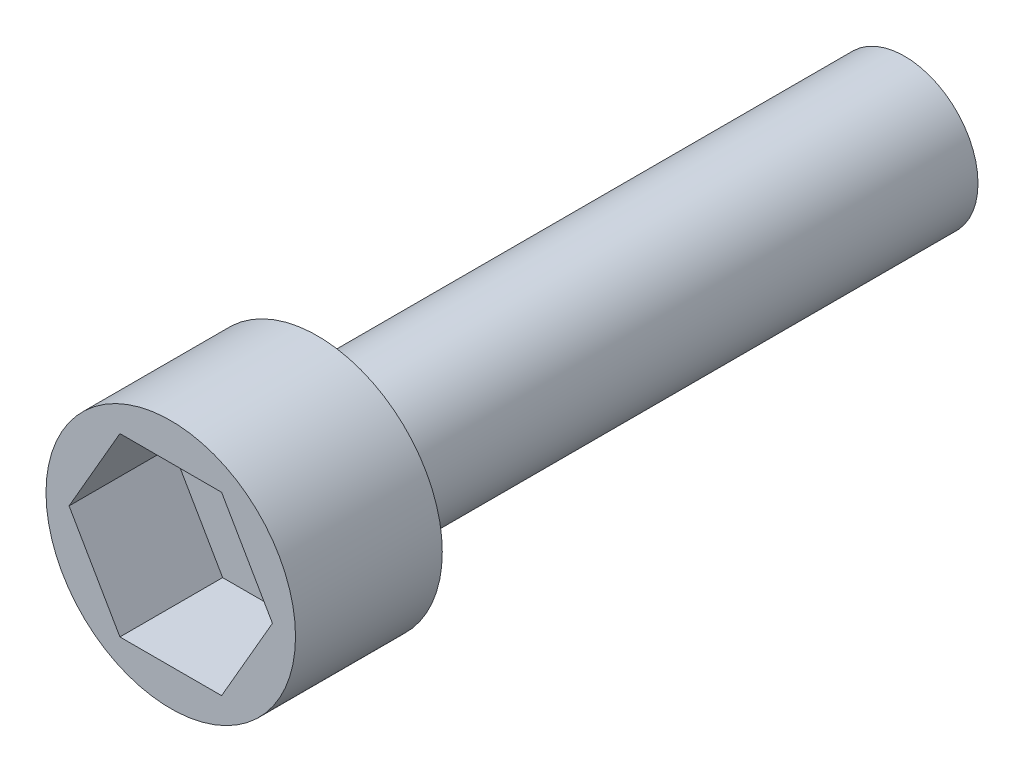
ISO-10303-21;
HEADER;
FILE_DESCRIPTION(('STEP AP214'),'2;1');
FILE_NAME('part.step','',(''),(''),'','','');
FILE_SCHEMA(('AUTOMOTIVE_DESIGN { 1 0 10303 214 1 1 1 1 }'));
ENDSEC;
DATA;
#1=APPLICATION_CONTEXT('core data for automotive mechanical design processes');
#2=APPLICATION_PROTOCOL_DEFINITION('international standard','automotive_design',2000,#1);
#3=PRODUCT_CONTEXT('',#1,'mechanical');
#4=PRODUCT('Part','Part','',(#3));
#5=PRODUCT_RELATED_PRODUCT_CATEGORY('part','',(#4));
#6=PRODUCT_DEFINITION_FORMATION('','',#4);
#7=PRODUCT_DEFINITION_CONTEXT('part definition',#1,'design');
#8=PRODUCT_DEFINITION('design','',#6,#7);
#9=PRODUCT_DEFINITION_SHAPE('','',#8);
#10=(LENGTH_UNIT() NAMED_UNIT(*) SI_UNIT(.MILLI.,.METRE.));
#11=(NAMED_UNIT(*) PLANE_ANGLE_UNIT() SI_UNIT($,.RADIAN.));
#12=(NAMED_UNIT(*) SI_UNIT($,.STERADIAN.) SOLID_ANGLE_UNIT());
#13=UNCERTAINTY_MEASURE_WITH_UNIT(LENGTH_MEASURE(1.E-05),#10,'distance_accuracy_value','');
#14=(GEOMETRIC_REPRESENTATION_CONTEXT(3) GLOBAL_UNCERTAINTY_ASSIGNED_CONTEXT((#13)) GLOBAL_UNIT_ASSIGNED_CONTEXT((#10,
#11,#12)) REPRESENTATION_CONTEXT('',''));
#15=CARTESIAN_POINT('',(0.,0.,0.));
#16=DIRECTION('',(0.,0.,1.));
#17=DIRECTION('',(1.,0.,0.));
#18=AXIS2_PLACEMENT_3D('',#15,#16,#17);
#19=CARTESIAN_POINT('',(0.,0.,20.));
#20=DIRECTION('',(0.,0.,-1.));
#21=DIRECTION('',(-1.,0.,0.));
#22=AXIS2_PLACEMENT_3D('',#19,#20,#21);
#23=CYLINDRICAL_SURFACE('',#22,2.5);
#24=CARTESIAN_POINT('',(0.,0.,20.));
#25=DIRECTION('',(0.,0.,1.));
#26=DIRECTION('',(1.,0.,0.));
#27=AXIS2_PLACEMENT_3D('',#24,#25,#26);
#28=CIRCLE('',#27,2.5);
#29=CARTESIAN_POINT('',(2.5,0.,20.));
#30=VERTEX_POINT('',#29);
#31=EDGE_CURVE('E11',#30,#30,#28,.T.);
#32=ORIENTED_EDGE('',*,*,#31,.F.);
#33=EDGE_LOOP('',(#32));
#34=FACE_BOUND('',#33,.T.);
#35=CARTESIAN_POINT('',(0.,0.,0.));
#36=DIRECTION('',(0.,0.,1.));
#37=DIRECTION('',(1.,0.,0.));
#38=AXIS2_PLACEMENT_3D('',#35,#36,#37);
#39=CIRCLE('',#38,2.5);
#40=CARTESIAN_POINT('',(2.5,0.,0.));
#41=VERTEX_POINT('',#40);
#42=EDGE_CURVE('E44',#41,#41,#39,.T.);
#43=ORIENTED_EDGE('',*,*,#42,.T.);
#44=EDGE_LOOP('',(#43));
#45=FACE_BOUND('',#44,.T.);
#46=ADVANCED_FACE('F41',(#34,#45),#23,.T.);
#47=CARTESIAN_POINT('',(0.,0.,0.));
#48=DIRECTION('',(0.,0.,1.));
#49=DIRECTION('',(1.,0.,0.));
#50=AXIS2_PLACEMENT_3D('',#47,#48,#49);
#51=PLANE('',#50);
#52=ORIENTED_EDGE('',*,*,#42,.F.);
#53=EDGE_LOOP('',(#52));
#54=FACE_BOUND('',#53,.T.);
#55=ADVANCED_FACE('F191',(#54),#51,.F.);
#56=CARTESIAN_POINT('',(0.,0.,25.));
#57=DIRECTION('',(0.,0.,-1.));
#58=DIRECTION('',(-1.,0.,0.));
#59=AXIS2_PLACEMENT_3D('',#56,#57,#58);
#60=CYLINDRICAL_SURFACE('',#59,4.25);
#61=CARTESIAN_POINT('',(0.,0.,25.));
#62=DIRECTION('',(0.,0.,1.));
#63=DIRECTION('',(1.,0.,0.));
#64=AXIS2_PLACEMENT_3D('',#61,#62,#63);
#65=CIRCLE('',#64,4.25);
#66=CARTESIAN_POINT('',(4.25,0.,25.));
#67=VERTEX_POINT('',#66);
#68=EDGE_CURVE('E165',#67,#67,#65,.T.);
#69=ORIENTED_EDGE('',*,*,#68,.F.);
#70=EDGE_LOOP('',(#69));
#71=FACE_BOUND('',#70,.T.);
#72=CARTESIAN_POINT('',(0.,0.,20.));
#73=DIRECTION('',(0.,0.,1.));
#74=DIRECTION('',(1.,0.,0.));
#75=AXIS2_PLACEMENT_3D('',#72,#73,#74);
#76=CIRCLE('',#75,4.25);
#77=CARTESIAN_POINT('',(4.25,0.,20.));
#78=VERTEX_POINT('',#77);
#79=EDGE_CURVE('E155',#78,#78,#76,.T.);
#80=ORIENTED_EDGE('',*,*,#79,.T.);
#81=EDGE_LOOP('',(#80));
#82=FACE_BOUND('',#81,.T.);
#83=ADVANCED_FACE('F173',(#71,#82),#60,.T.);
#84=CARTESIAN_POINT('',(0.,0.,25.));
#85=DIRECTION('',(0.,0.,1.));
#86=DIRECTION('',(1.,0.,0.));
#87=AXIS2_PLACEMENT_3D('',#84,#85,#86);
#88=PLANE('',#87);
#89=DIRECTION('',(0.5,0.866025403784439,0.));
#90=VECTOR('',#89,1.);
#91=CARTESIAN_POINT('',(1.73205080756888,-3.,25.));
#92=LINE('',#91,#90);
#93=CARTESIAN_POINT('',(1.73205080756888,-3.,25.));
#94=VERTEX_POINT('',#93);
#95=CARTESIAN_POINT('',(3.46410161513775,0.,25.));
#96=VERTEX_POINT('',#95);
#97=EDGE_CURVE('E56',#94,#96,#92,.T.);
#98=ORIENTED_EDGE('',*,*,#97,.F.);
#99=DIRECTION('',(1.,0.,0.));
#100=VECTOR('',#99,1.);
#101=CARTESIAN_POINT('',(-1.73205080756888,-3.,25.));
#102=LINE('',#101,#100);
#103=CARTESIAN_POINT('',(-1.73205080756888,-3.,25.));
#104=VERTEX_POINT('',#103);
#105=EDGE_CURVE('E149',#104,#94,#102,.T.);
#106=ORIENTED_EDGE('',*,*,#105,.F.);
#107=DIRECTION('',(0.5,-0.866025403784439,0.));
#108=VECTOR('',#107,1.);
#109=CARTESIAN_POINT('',(-3.46410161513775,0.,25.));
#110=LINE('',#109,#108);
#111=CARTESIAN_POINT('',(-3.46410161513775,0.,25.));
#112=VERTEX_POINT('',#111);
#113=EDGE_CURVE('E146',#112,#104,#110,.T.);
#114=ORIENTED_EDGE('',*,*,#113,.F.);
#115=DIRECTION('',(-0.5,-0.866025403784439,0.));
#116=VECTOR('',#115,1.);
#117=CARTESIAN_POINT('',(-1.73205080756888,3.,25.));
#118=LINE('',#117,#116);
#119=CARTESIAN_POINT('',(-1.73205080756888,3.,25.));
#120=VERTEX_POINT('',#119);
#121=EDGE_CURVE('E104',#120,#112,#118,.T.);
#122=ORIENTED_EDGE('',*,*,#121,.F.);
#123=DIRECTION('',(-1.,0.,0.));
#124=VECTOR('',#123,1.);
#125=CARTESIAN_POINT('',(1.73205080756888,3.,25.));
#126=LINE('',#125,#124);
#127=CARTESIAN_POINT('',(1.73205080756888,3.,25.));
#128=VERTEX_POINT('',#127);
#129=EDGE_CURVE('E140',#128,#120,#126,.T.);
#130=ORIENTED_EDGE('',*,*,#129,.F.);
#131=DIRECTION('',(-0.5,0.866025403784438,0.));
#132=VECTOR('',#131,1.);
#133=CARTESIAN_POINT('',(3.46410161513775,0.,25.));
#134=LINE('',#133,#132);
#135=EDGE_CURVE('E136',#96,#128,#134,.T.);
#136=ORIENTED_EDGE('',*,*,#135,.F.);
#137=EDGE_LOOP('',(#98,#106,#114,#122,#130,#136));
#138=FACE_BOUND('',#137,.T.);
#139=ORIENTED_EDGE('',*,*,#68,.T.);
#140=EDGE_LOOP('',(#139));
#141=FACE_BOUND('',#140,.T.);
#142=ADVANCED_FACE('F178',(#138,#141),#88,.T.);
#143=CARTESIAN_POINT('',(0.,0.,20.));
#144=DIRECTION('',(0.,0.,1.));
#145=DIRECTION('',(1.,0.,0.));
#146=AXIS2_PLACEMENT_3D('',#143,#144,#145);
#147=PLANE('',#146);
#148=ORIENTED_EDGE('',*,*,#31,.T.);
#149=EDGE_LOOP('',(#148));
#150=FACE_BOUND('',#149,.T.);
#151=ORIENTED_EDGE('',*,*,#79,.F.);
#152=EDGE_LOOP('',(#151));
#153=FACE_BOUND('',#152,.T.);
#154=ADVANCED_FACE('F175',(#150,#153),#147,.F.);
#155=CARTESIAN_POINT('',(1.73205080756888,-3.,21.5));
#156=DIRECTION('',(0.866025403784439,-0.5,0.));
#157=DIRECTION('',(0.5,0.866025403784439,0.));
#158=AXIS2_PLACEMENT_3D('',#155,#156,#157);
#159=PLANE('',#158);
#160=ORIENTED_EDGE('',*,*,#97,.T.);
#161=DIRECTION('',(0.,0.,1.));
#162=VECTOR('',#161,1.);
#163=CARTESIAN_POINT('',(3.46410161513775,0.,21.5));
#164=LINE('',#163,#162);
#165=CARTESIAN_POINT('',(3.46410161513775,0.,21.5));
#166=VERTEX_POINT('',#165);
#167=EDGE_CURVE('E86',#166,#96,#164,.T.);
#168=ORIENTED_EDGE('',*,*,#167,.F.);
#169=DIRECTION('',(0.5,0.866025403784439,0.));
#170=VECTOR('',#169,1.);
#171=CARTESIAN_POINT('',(1.73205080756888,-3.,21.5));
#172=LINE('',#171,#170);
#173=CARTESIAN_POINT('',(1.73205080756888,-3.,21.5));
#174=VERTEX_POINT('',#173);
#175=EDGE_CURVE('E152',#174,#166,#172,.T.);
#176=ORIENTED_EDGE('',*,*,#175,.F.);
#177=DIRECTION('',(0.,0.,1.));
#178=VECTOR('',#177,1.);
#179=CARTESIAN_POINT('',(1.73205080756888,-3.,21.5));
#180=LINE('',#179,#178);
#181=EDGE_CURVE('E64',#174,#94,#180,.T.);
#182=ORIENTED_EDGE('',*,*,#181,.T.);
#183=EDGE_LOOP('',(#160,#168,#176,#182));
#184=FACE_BOUND('',#183,.T.);
#185=ADVANCED_FACE('F177',(#184),#159,.F.);
#186=CARTESIAN_POINT('',(-1.73205080756888,-3.,21.5));
#187=DIRECTION('',(0.,-1.,0.));
#188=DIRECTION('',(0.,0.,-1.));
#189=AXIS2_PLACEMENT_3D('',#186,#187,#188);
#190=PLANE('',#189);
#191=ORIENTED_EDGE('',*,*,#105,.T.);
#192=ORIENTED_EDGE('',*,*,#181,.F.);
#193=DIRECTION('',(1.,0.,0.));
#194=VECTOR('',#193,1.);
#195=CARTESIAN_POINT('',(-1.73205080756888,-3.,21.5));
#196=LINE('',#195,#194);
#197=CARTESIAN_POINT('',(-1.73205080756888,-3.,21.5));
#198=VERTEX_POINT('',#197);
#199=EDGE_CURVE('E118',#198,#174,#196,.T.);
#200=ORIENTED_EDGE('',*,*,#199,.F.);
#201=DIRECTION('',(0.,0.,1.));
#202=VECTOR('',#201,1.);
#203=CARTESIAN_POINT('',(-1.73205080756888,-3.,21.5));
#204=LINE('',#203,#202);
#205=EDGE_CURVE('E109',#198,#104,#204,.T.);
#206=ORIENTED_EDGE('',*,*,#205,.T.);
#207=EDGE_LOOP('',(#191,#192,#200,#206));
#208=FACE_BOUND('',#207,.T.);
#209=ADVANCED_FACE('F185',(#208),#190,.F.);
#210=CARTESIAN_POINT('',(-3.46410161513775,0.,21.5));
#211=DIRECTION('',(-0.866025403784439,-0.5,0.));
#212=DIRECTION('',(0.5,-0.866025403784439,0.));
#213=AXIS2_PLACEMENT_3D('',#210,#211,#212);
#214=PLANE('',#213);
#215=ORIENTED_EDGE('',*,*,#113,.T.);
#216=ORIENTED_EDGE('',*,*,#205,.F.);
#217=DIRECTION('',(0.5,-0.866025403784439,0.));
#218=VECTOR('',#217,1.);
#219=CARTESIAN_POINT('',(-3.46410161513775,0.,21.5));
#220=LINE('',#219,#218);
#221=CARTESIAN_POINT('',(-3.46410161513775,0.,21.5));
#222=VERTEX_POINT('',#221);
#223=EDGE_CURVE('E113',#222,#198,#220,.T.);
#224=ORIENTED_EDGE('',*,*,#223,.F.);
#225=DIRECTION('',(0.,0.,1.));
#226=VECTOR('',#225,1.);
#227=CARTESIAN_POINT('',(-3.46410161513775,0.,21.5));
#228=LINE('',#227,#226);
#229=EDGE_CURVE('E97',#222,#112,#228,.T.);
#230=ORIENTED_EDGE('',*,*,#229,.T.);
#231=EDGE_LOOP('',(#215,#216,#224,#230));
#232=FACE_BOUND('',#231,.T.);
#233=ADVANCED_FACE('F114',(#232),#214,.F.);
#234=CARTESIAN_POINT('',(-1.73205080756888,3.,21.5));
#235=DIRECTION('',(-0.866025403784439,0.5,0.));
#236=DIRECTION('',(-0.5,-0.866025403784439,0.));
#237=AXIS2_PLACEMENT_3D('',#234,#235,#236);
#238=PLANE('',#237);
#239=ORIENTED_EDGE('',*,*,#121,.T.);
#240=ORIENTED_EDGE('',*,*,#229,.F.);
#241=DIRECTION('',(-0.5,-0.866025403784439,0.));
#242=VECTOR('',#241,1.);
#243=CARTESIAN_POINT('',(-1.73205080756888,3.,21.5));
#244=LINE('',#243,#242);
#245=CARTESIAN_POINT('',(-1.73205080756888,3.,21.5));
#246=VERTEX_POINT('',#245);
#247=EDGE_CURVE('E101',#246,#222,#244,.T.);
#248=ORIENTED_EDGE('',*,*,#247,.F.);
#249=DIRECTION('',(0.,0.,1.));
#250=VECTOR('',#249,1.);
#251=CARTESIAN_POINT('',(-1.73205080756888,3.,21.5));
#252=LINE('',#251,#250);
#253=EDGE_CURVE('E110',#246,#120,#252,.T.);
#254=ORIENTED_EDGE('',*,*,#253,.T.);
#255=EDGE_LOOP('',(#239,#240,#248,#254));
#256=FACE_BOUND('',#255,.T.);
#257=ADVANCED_FACE('F99',(#256),#238,.F.);
#258=CARTESIAN_POINT('',(1.73205080756888,3.,21.5));
#259=DIRECTION('',(0.,1.,0.));
#260=DIRECTION('',(0.,0.,1.));
#261=AXIS2_PLACEMENT_3D('',#258,#259,#260);
#262=PLANE('',#261);
#263=ORIENTED_EDGE('',*,*,#129,.T.);
#264=ORIENTED_EDGE('',*,*,#253,.F.);
#265=DIRECTION('',(-1.,0.,0.));
#266=VECTOR('',#265,1.);
#267=CARTESIAN_POINT('',(1.73205080756888,3.,21.5));
#268=LINE('',#267,#266);
#269=CARTESIAN_POINT('',(1.73205080756888,3.,21.5));
#270=VERTEX_POINT('',#269);
#271=EDGE_CURVE('E124',#270,#246,#268,.T.);
#272=ORIENTED_EDGE('',*,*,#271,.F.);
#273=DIRECTION('',(0.,0.,1.));
#274=VECTOR('',#273,1.);
#275=CARTESIAN_POINT('',(1.73205080756888,3.,21.5));
#276=LINE('',#275,#274);
#277=EDGE_CURVE('E160',#270,#128,#276,.T.);
#278=ORIENTED_EDGE('',*,*,#277,.T.);
#279=EDGE_LOOP('',(#263,#264,#272,#278));
#280=FACE_BOUND('',#279,.T.);
#281=ADVANCED_FACE('F247',(#280),#262,.F.);
#282=CARTESIAN_POINT('',(3.46410161513775,0.,21.5));
#283=DIRECTION('',(0.866025403784438,0.5,0.));
#284=DIRECTION('',(-0.5,0.866025403784439,0.));
#285=AXIS2_PLACEMENT_3D('',#282,#283,#284);
#286=PLANE('',#285);
#287=ORIENTED_EDGE('',*,*,#135,.T.);
#288=ORIENTED_EDGE('',*,*,#277,.F.);
#289=DIRECTION('',(-0.5,0.866025403784438,0.));
#290=VECTOR('',#289,1.);
#291=CARTESIAN_POINT('',(3.46410161513775,0.,21.5));
#292=LINE('',#291,#290);
#293=EDGE_CURVE('E128',#166,#270,#292,.T.);
#294=ORIENTED_EDGE('',*,*,#293,.F.);
#295=ORIENTED_EDGE('',*,*,#167,.T.);
#296=EDGE_LOOP('',(#287,#288,#294,#295));
#297=FACE_BOUND('',#296,.T.);
#298=ADVANCED_FACE('F256',(#297),#286,.F.);
#299=CARTESIAN_POINT('',(0.,0.,21.5));
#300=DIRECTION('',(0.,0.,1.));
#301=DIRECTION('',(1.,0.,0.));
#302=AXIS2_PLACEMENT_3D('',#299,#300,#301);
#303=PLANE('',#302);
#304=ORIENTED_EDGE('',*,*,#175,.T.);
#305=ORIENTED_EDGE('',*,*,#293,.T.);
#306=ORIENTED_EDGE('',*,*,#271,.T.);
#307=ORIENTED_EDGE('',*,*,#247,.T.);
#308=ORIENTED_EDGE('',*,*,#223,.T.);
#309=ORIENTED_EDGE('',*,*,#199,.T.);
#310=EDGE_LOOP('',(#304,#305,#306,#307,#308,#309));
#311=FACE_BOUND('',#310,.T.);
#312=ADVANCED_FACE('F121',(#311),#303,.T.);
#313=CLOSED_SHELL('',(#46,#55,#83,#142,#154,#185,#209,#233,#257,#281,#298,#312));
#314=MANIFOLD_SOLID_BREP('B2',#313);
#315=ADVANCED_BREP_SHAPE_REPRESENTATION('',(#18,#314),#14);
#316=SHAPE_DEFINITION_REPRESENTATION(#9,#315);
ENDSEC;
END-ISO-10303-21;
